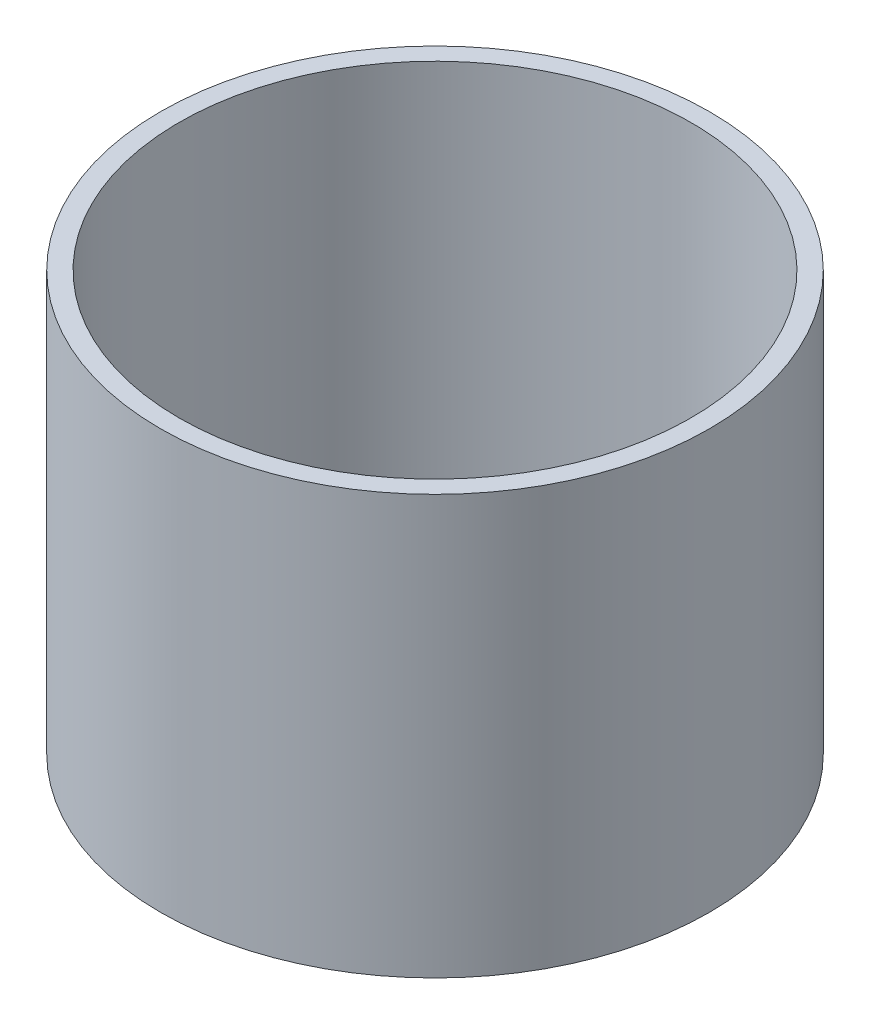
ISO-10303-21;
HEADER;
FILE_DESCRIPTION(('STEP AP214'),'2;1');
FILE_NAME('part.step','',(''),(''),'','','');
FILE_SCHEMA(('AUTOMOTIVE_DESIGN { 1 0 10303 214 1 1 1 1 }'));
ENDSEC;
DATA;
#1=APPLICATION_CONTEXT('core data for automotive mechanical design processes');
#2=APPLICATION_PROTOCOL_DEFINITION('international standard','automotive_design',2000,#1);
#3=PRODUCT_CONTEXT('',#1,'mechanical');
#4=PRODUCT('Part','Part','',(#3));
#5=PRODUCT_RELATED_PRODUCT_CATEGORY('part','',(#4));
#6=PRODUCT_DEFINITION_FORMATION('','',#4);
#7=PRODUCT_DEFINITION_CONTEXT('part definition',#1,'design');
#8=PRODUCT_DEFINITION('design','',#6,#7);
#9=PRODUCT_DEFINITION_SHAPE('','',#8);
#10=(LENGTH_UNIT() NAMED_UNIT(*) SI_UNIT(.MILLI.,.METRE.));
#11=(NAMED_UNIT(*) PLANE_ANGLE_UNIT() SI_UNIT($,.RADIAN.));
#12=(NAMED_UNIT(*) SI_UNIT($,.STERADIAN.) SOLID_ANGLE_UNIT());
#13=UNCERTAINTY_MEASURE_WITH_UNIT(LENGTH_MEASURE(1.E-05),#10,'distance_accuracy_value','');
#14=(GEOMETRIC_REPRESENTATION_CONTEXT(3) GLOBAL_UNCERTAINTY_ASSIGNED_CONTEXT((#13)) GLOBAL_UNIT_ASSIGNED_CONTEXT((#10,
#11,#12)) REPRESENTATION_CONTEXT('',''));
#15=CARTESIAN_POINT('',(0.,0.,0.));
#16=DIRECTION('',(0.,0.,1.));
#17=DIRECTION('',(1.,0.,0.));
#18=AXIS2_PLACEMENT_3D('',#15,#16,#17);
#19=CARTESIAN_POINT('',(0.,180.,0.));
#20=DIRECTION('',(0.,-1.,0.));
#21=DIRECTION('',(0.,0.,-1.));
#22=AXIS2_PLACEMENT_3D('',#19,#20,#21);
#23=CYLINDRICAL_SURFACE('',#22,118.);
#24=CARTESIAN_POINT('',(0.,180.,0.));
#25=DIRECTION('',(0.,1.,0.));
#26=DIRECTION('',(0.,0.,1.));
#27=AXIS2_PLACEMENT_3D('',#24,#25,#26);
#28=CIRCLE('',#27,118.);
#29=CARTESIAN_POINT('',(0.,180.,-118.));
#30=VERTEX_POINT('',#29);
#31=EDGE_CURVE('E196',#30,#30,#28,.T.);
#32=CARTESIAN_POINT('',(0.,0.,0.));
#33=DIRECTION('',(0.,1.,0.));
#34=DIRECTION('',(0.,0.,1.));
#35=AXIS2_PLACEMENT_3D('',#32,#33,#34);
#36=CIRCLE('',#35,118.);
#37=CARTESIAN_POINT('',(0.,0.,-118.));
#38=VERTEX_POINT('',#37);
#39=EDGE_CURVE('E195',#38,#38,#36,.T.);
#40=CARTESIAN_POINT('',(0.,180.,-118.));
#41=CARTESIAN_POINT('',(0.,178.125,-118.));
#42=CARTESIAN_POINT('',(0.,176.25,-118.));
#43=CARTESIAN_POINT('',(0.,172.5,-118.));
#44=CARTESIAN_POINT('',(0.,170.625,-118.));
#45=CARTESIAN_POINT('',(0.,166.875,-118.));
#46=CARTESIAN_POINT('',(0.,165.,-118.));
#47=CARTESIAN_POINT('',(0.,161.25,-118.));
#48=CARTESIAN_POINT('',(0.,159.375,-118.));
#49=CARTESIAN_POINT('',(0.,155.625,-118.));
#50=CARTESIAN_POINT('',(0.,153.75,-118.));
#51=CARTESIAN_POINT('',(0.,150.,-118.));
#52=CARTESIAN_POINT('',(0.,148.125,-118.));
#53=CARTESIAN_POINT('',(0.,144.375,-118.));
#54=CARTESIAN_POINT('',(0.,142.5,-118.));
#55=CARTESIAN_POINT('',(0.,138.75,-118.));
#56=CARTESIAN_POINT('',(0.,136.875,-118.));
#57=CARTESIAN_POINT('',(0.,133.125,-118.));
#58=CARTESIAN_POINT('',(0.,131.25,-118.));
#59=CARTESIAN_POINT('',(0.,127.5,-118.));
#60=CARTESIAN_POINT('',(0.,125.625,-118.));
#61=CARTESIAN_POINT('',(0.,121.875,-118.));
#62=CARTESIAN_POINT('',(0.,120.,-118.));
#63=CARTESIAN_POINT('',(0.,116.25,-118.));
#64=CARTESIAN_POINT('',(0.,114.375,-118.));
#65=CARTESIAN_POINT('',(0.,110.625,-118.));
#66=CARTESIAN_POINT('',(0.,108.75,-118.));
#67=CARTESIAN_POINT('',(0.,105.,-118.));
#68=CARTESIAN_POINT('',(0.,103.125,-118.));
#69=CARTESIAN_POINT('',(0.,99.375,-118.));
#70=CARTESIAN_POINT('',(0.,97.5,-118.));
#71=CARTESIAN_POINT('',(0.,93.75,-118.));
#72=CARTESIAN_POINT('',(0.,91.875,-118.));
#73=CARTESIAN_POINT('',(0.,88.125,-118.));
#74=CARTESIAN_POINT('',(0.,86.25,-118.));
#75=CARTESIAN_POINT('',(0.,82.5,-118.));
#76=CARTESIAN_POINT('',(0.,80.625,-118.));
#77=CARTESIAN_POINT('',(0.,76.875,-118.));
#78=CARTESIAN_POINT('',(0.,75.,-118.));
#79=CARTESIAN_POINT('',(0.,71.25,-118.));
#80=CARTESIAN_POINT('',(0.,69.375,-118.));
#81=CARTESIAN_POINT('',(0.,65.625,-118.));
#82=CARTESIAN_POINT('',(0.,63.75,-118.));
#83=CARTESIAN_POINT('',(0.,60.,-118.));
#84=CARTESIAN_POINT('',(0.,58.125,-118.));
#85=CARTESIAN_POINT('',(0.,54.375,-118.));
#86=CARTESIAN_POINT('',(0.,52.5,-118.));
#87=CARTESIAN_POINT('',(0.,48.75,-118.));
#88=CARTESIAN_POINT('',(0.,46.875,-118.));
#89=CARTESIAN_POINT('',(0.,43.125,-118.));
#90=CARTESIAN_POINT('',(0.,41.25,-118.));
#91=CARTESIAN_POINT('',(0.,37.5,-118.));
#92=CARTESIAN_POINT('',(0.,35.625,-118.));
#93=CARTESIAN_POINT('',(0.,31.875,-118.));
#94=CARTESIAN_POINT('',(0.,30.,-118.));
#95=CARTESIAN_POINT('',(0.,26.25,-118.));
#96=CARTESIAN_POINT('',(0.,24.375,-118.));
#97=CARTESIAN_POINT('',(0.,20.625,-118.));
#98=CARTESIAN_POINT('',(0.,18.75,-118.));
#99=CARTESIAN_POINT('',(0.,15.,-118.));
#100=CARTESIAN_POINT('',(0.,13.125,-118.));
#101=CARTESIAN_POINT('',(0.,9.37499999999998,-118.));
#102=CARTESIAN_POINT('',(0.,7.49999999999997,-118.));
#103=CARTESIAN_POINT('',(0.,3.74999999999997,-118.));
#104=CARTESIAN_POINT('',(0.,1.87499999999997,-118.));
#105=CARTESIAN_POINT('',(0.,0.,-118.));
#106=B_SPLINE_CURVE_WITH_KNOTS('',3,(#40,#41,#42,#43,#44,#45,#46,#47,#48,#49,#50,#51,#52,#53,
#54,#55,#56,#57,#58,#59,#60,#61,#62,#63,#64,#65,#66,#67,#68,#69,#70,#71,#72,#73,#74,#75,#76,#77,
#78,#79,#80,#81,#82,#83,#84,#85,#86,#87,#88,#89,#90,#91,#92,#93,#94,#95,#96,#97,#98,#99,#100,
#101,#102,#103,#104,#105),.UNSPECIFIED.,.F.,.F.,(4,2,2,2,2,2,2,2,2,2,2,2,2,2,2,2,2,2,2,2,2,2,2,
2,2,2,2,2,2,2,2,2,4),(0.,5.62500000000002,11.25,16.875,22.5,28.125,33.75,39.375,45.,50.625,
56.25,61.875,67.5,73.125,78.75,84.375,90.,95.625,101.25,106.875,112.5,118.125,123.75,129.375,
135.,140.625,146.25,151.875,157.5,163.125,168.75,174.375,180.),.UNSPECIFIED.);
#107=EDGE_CURVE('BSEAM44',#30,#38,#106,.T.);
#108=ORIENTED_EDGE('',*,*,#31,.F.);
#109=ORIENTED_EDGE('',*,*,#39,.T.);
#110=ORIENTED_EDGE('',*,*,#107,.T.);
#111=ORIENTED_EDGE('',*,*,#107,.F.);
#112=EDGE_LOOP('',(#108,#110,#109,#111));
#113=FACE_BOUND('',#112,.T.);
#114=ADVANCED_FACE('F44',(#113),#23,.T.);
#115=CARTESIAN_POINT('',(0.,180.,0.));
#116=DIRECTION('',(0.,1.,0.));
#117=DIRECTION('',(0.,0.,1.));
#118=AXIS2_PLACEMENT_3D('',#115,#116,#117);
#119=PLANE('',#118);
#120=CARTESIAN_POINT('',(0.,180.,0.));
#121=DIRECTION('',(0.,1.,0.));
#122=DIRECTION('',(0.,0.,1.));
#123=AXIS2_PLACEMENT_3D('',#120,#121,#122);
#124=CIRCLE('',#123,110.);
#125=CARTESIAN_POINT('',(0.,180.,110.));
#126=VERTEX_POINT('',#125);
#127=EDGE_CURVE('E178',#126,#126,#124,.T.);
#128=ORIENTED_EDGE('',*,*,#127,.F.);
#129=EDGE_LOOP('',(#128));
#130=FACE_BOUND('',#129,.T.);
#131=ORIENTED_EDGE('',*,*,#31,.T.);
#132=EDGE_LOOP('',(#131));
#133=FACE_BOUND('',#132,.T.);
#134=ADVANCED_FACE('F232',(#130,#133),#119,.T.);
#135=CARTESIAN_POINT('',(0.,0.,0.));
#136=DIRECTION('',(0.,1.,0.));
#137=DIRECTION('',(0.,0.,1.));
#138=AXIS2_PLACEMENT_3D('',#135,#136,#137);
#139=PLANE('',#138);
#140=DIRECTION('',(-1.,0.,0.));
#141=VECTOR('',#140,1.);
#142=CARTESIAN_POINT('',(-8.20167008536623,0.,57.0914097078924));
#143=LINE('',#142,#141);
#144=CARTESIAN_POINT('',(8.41597697617629,0.,57.0914097078924));
#145=VERTEX_POINT('',#144);
#146=CARTESIAN_POINT('',(-8.20167008536623,0.,57.0914097078924));
#147=VERTEX_POINT('',#146);
#148=EDGE_CURVE('E121',#145,#147,#143,.T.);
#149=ORIENTED_EDGE('',*,*,#148,.F.);
#150=DIRECTION('',(0.,0.,1.));
#151=VECTOR('',#150,1.);
#152=CARTESIAN_POINT('',(8.41597697617629,0.,57.0914097078924));
#153=LINE('',#152,#151);
#154=CARTESIAN_POINT('',(8.41597697617629,0.,32.0914097078925));
#155=VERTEX_POINT('',#154);
#156=EDGE_CURVE('E59',#155,#145,#153,.T.);
#157=ORIENTED_EDGE('',*,*,#156,.F.);
#158=DIRECTION('',(1.,0.,0.));
#159=VECTOR('',#158,1.);
#160=CARTESIAN_POINT('',(-8.20167008536623,0.,32.0914097078925));
#161=LINE('',#160,#159);
#162=CARTESIAN_POINT('',(-8.20167008536623,0.,32.0914097078925));
#163=VERTEX_POINT('',#162);
#164=EDGE_CURVE('E129',#163,#155,#161,.T.);
#165=ORIENTED_EDGE('',*,*,#164,.F.);
#166=DIRECTION('',(0.,0.,-1.));
#167=VECTOR('',#166,1.);
#168=CARTESIAN_POINT('',(-8.20167008536623,0.,57.0914097078924));
#169=LINE('',#168,#167);
#170=EDGE_CURVE('E111',#147,#163,#169,.T.);
#171=ORIENTED_EDGE('',*,*,#170,.F.);
#172=EDGE_LOOP('',(#149,#157,#165,#171));
#173=FACE_BOUND('',#172,.T.);
#174=DIRECTION('',(1.,0.,0.));
#175=VECTOR('',#174,1.);
#176=CARTESIAN_POINT('',(-9.885,0.,22.915));
#177=LINE('',#176,#175);
#178=CARTESIAN_POINT('',(-9.885,0.,22.915));
#179=VERTEX_POINT('',#178);
#180=CARTESIAN_POINT('',(9.885,0.,22.915));
#181=VERTEX_POINT('',#180);
#182=EDGE_CURVE('E157',#179,#181,#177,.T.);
#183=ORIENTED_EDGE('',*,*,#182,.T.);
#184=DIRECTION('',(0.,0.,-1.));
#185=VECTOR('',#184,1.);
#186=CARTESIAN_POINT('',(9.885,0.,-22.915));
#187=LINE('',#186,#185);
#188=CARTESIAN_POINT('',(9.885,0.,-22.915));
#189=VERTEX_POINT('',#188);
#190=EDGE_CURVE('E144',#181,#189,#187,.T.);
#191=ORIENTED_EDGE('',*,*,#190,.T.);
#192=DIRECTION('',(-1.,0.,0.));
#193=VECTOR('',#192,1.);
#194=CARTESIAN_POINT('',(-9.885,0.,-22.915));
#195=LINE('',#194,#193);
#196=CARTESIAN_POINT('',(-9.885,0.,-22.915));
#197=VERTEX_POINT('',#196);
#198=EDGE_CURVE('E148',#189,#197,#195,.T.);
#199=ORIENTED_EDGE('',*,*,#198,.T.);
#200=DIRECTION('',(0.,0.,1.));
#201=VECTOR('',#200,1.);
#202=CARTESIAN_POINT('',(-9.885,0.,-22.915));
#203=LINE('',#202,#201);
#204=EDGE_CURVE('E153',#197,#179,#203,.T.);
#205=ORIENTED_EDGE('',*,*,#204,.T.);
#206=EDGE_LOOP('',(#183,#191,#199,#205));
#207=FACE_BOUND('',#206,.T.);
#208=ORIENTED_EDGE('',*,*,#39,.F.);
#209=EDGE_LOOP('',(#208));
#210=FACE_BOUND('',#209,.T.);
#211=ADVANCED_FACE('F126',(#173,#207,#210),#139,.F.);
#212=CARTESIAN_POINT('',(0.,-311.126983722081,0.));
#213=DIRECTION('',(0.,1.,0.));
#214=DIRECTION('',(0.,0.,1.));
#215=AXIS2_PLACEMENT_3D('',#212,#213,#214);
#216=CYLINDRICAL_SURFACE('',#215,110.);
#217=CARTESIAN_POINT('',(0.,8.00000000000001,0.));
#218=DIRECTION('',(0.,1.,0.));
#219=DIRECTION('',(0.,0.,1.));
#220=AXIS2_PLACEMENT_3D('',#217,#218,#219);
#221=CIRCLE('',#220,110.);
#222=CARTESIAN_POINT('',(0.,7.99999999999995,110.));
#223=VERTEX_POINT('',#222);
#224=EDGE_CURVE('E191',#223,#223,#221,.F.);
#225=CARTESIAN_POINT('',(0.,7.99999999999995,110.));
#226=CARTESIAN_POINT('',(0.,9.79166666666662,110.));
#227=CARTESIAN_POINT('',(0.,11.5833333333333,110.));
#228=CARTESIAN_POINT('',(0.,15.1666666666666,110.));
#229=CARTESIAN_POINT('',(0.,16.9583333333333,110.));
#230=CARTESIAN_POINT('',(0.,20.5416666666666,110.));
#231=CARTESIAN_POINT('',(0.,22.3333333333333,110.));
#232=CARTESIAN_POINT('',(0.,25.9166666666666,110.));
#233=CARTESIAN_POINT('',(0.,27.7083333333333,110.));
#234=CARTESIAN_POINT('',(0.,31.2916666666666,110.));
#235=CARTESIAN_POINT('',(0.,33.0833333333333,110.));
#236=CARTESIAN_POINT('',(0.,36.6666666666666,110.));
#237=CARTESIAN_POINT('',(0.,38.4583333333333,110.));
#238=CARTESIAN_POINT('',(0.,42.0416666666666,110.));
#239=CARTESIAN_POINT('',(0.,43.8333333333333,110.));
#240=CARTESIAN_POINT('',(0.,47.4166666666666,110.));
#241=CARTESIAN_POINT('',(0.,49.2083333333333,110.));
#242=CARTESIAN_POINT('',(0.,52.7916666666666,110.));
#243=CARTESIAN_POINT('',(0.,54.5833333333333,110.));
#244=CARTESIAN_POINT('',(0.,58.1666666666666,110.));
#245=CARTESIAN_POINT('',(0.,59.9583333333333,110.));
#246=CARTESIAN_POINT('',(0.,63.5416666666666,110.));
#247=CARTESIAN_POINT('',(0.,65.3333333333333,110.));
#248=CARTESIAN_POINT('',(0.,68.9166666666666,110.));
#249=CARTESIAN_POINT('',(0.,70.7083333333333,110.));
#250=CARTESIAN_POINT('',(0.,74.2916666666666,110.));
#251=CARTESIAN_POINT('',(0.,76.0833333333333,110.));
#252=CARTESIAN_POINT('',(0.,79.6666666666666,110.));
#253=CARTESIAN_POINT('',(0.,81.4583333333333,110.));
#254=CARTESIAN_POINT('',(0.,85.0416666666666,110.));
#255=CARTESIAN_POINT('',(0.,86.8333333333333,110.));
#256=CARTESIAN_POINT('',(0.,90.4166666666666,110.));
#257=CARTESIAN_POINT('',(0.,92.2083333333333,110.));
#258=CARTESIAN_POINT('',(0.,95.7916666666666,110.));
#259=CARTESIAN_POINT('',(0.,97.5833333333333,110.));
#260=CARTESIAN_POINT('',(0.,101.166666666667,110.));
#261=CARTESIAN_POINT('',(0.,102.958333333333,110.));
#262=CARTESIAN_POINT('',(0.,106.541666666667,110.));
#263=CARTESIAN_POINT('',(0.,108.333333333333,110.));
#264=CARTESIAN_POINT('',(0.,111.916666666667,110.));
#265=CARTESIAN_POINT('',(0.,113.708333333333,110.));
#266=CARTESIAN_POINT('',(0.,117.291666666667,110.));
#267=CARTESIAN_POINT('',(0.,119.083333333333,110.));
#268=CARTESIAN_POINT('',(0.,122.666666666667,110.));
#269=CARTESIAN_POINT('',(0.,124.458333333333,110.));
#270=CARTESIAN_POINT('',(0.,128.041666666667,110.));
#271=CARTESIAN_POINT('',(0.,129.833333333333,110.));
#272=CARTESIAN_POINT('',(0.,133.416666666667,110.));
#273=CARTESIAN_POINT('',(0.,135.208333333333,110.));
#274=CARTESIAN_POINT('',(0.,138.791666666667,110.));
#275=CARTESIAN_POINT('',(0.,140.583333333333,110.));
#276=CARTESIAN_POINT('',(0.,144.166666666667,110.));
#277=CARTESIAN_POINT('',(0.,145.958333333333,110.));
#278=CARTESIAN_POINT('',(0.,149.541666666667,110.));
#279=CARTESIAN_POINT('',(0.,151.333333333333,110.));
#280=CARTESIAN_POINT('',(0.,154.916666666667,110.));
#281=CARTESIAN_POINT('',(0.,156.708333333333,110.));
#282=CARTESIAN_POINT('',(0.,160.291666666667,110.));
#283=CARTESIAN_POINT('',(0.,162.083333333333,110.));
#284=CARTESIAN_POINT('',(0.,165.666666666667,110.));
#285=CARTESIAN_POINT('',(0.,167.458333333333,110.));
#286=CARTESIAN_POINT('',(0.,171.041666666667,110.));
#287=CARTESIAN_POINT('',(0.,172.833333333333,110.));
#288=CARTESIAN_POINT('',(0.,176.416666666667,110.));
#289=CARTESIAN_POINT('',(0.,178.208333333333,110.));
#290=CARTESIAN_POINT('',(0.,180.,110.));
#291=B_SPLINE_CURVE_WITH_KNOTS('',3,(#225,#226,#227,#228,#229,#230,#231,#232,#233,#234,#235,
#236,#237,#238,#239,#240,#241,#242,#243,#244,#245,#246,#247,#248,#249,#250,#251,#252,#253,#254,
#255,#256,#257,#258,#259,#260,#261,#262,#263,#264,#265,#266,#267,#268,#269,#270,#271,#272,#273,
#274,#275,#276,#277,#278,#279,#280,#281,#282,#283,#284,#285,#286,#287,#288,#289,#290),
.UNSPECIFIED.,.F.,.F.,(4,2,2,2,2,2,2,2,2,2,2,2,2,2,2,2,2,2,2,2,2,2,2,2,2,2,2,2,2,2,2,2,4),(0.,
5.37500000000002,10.75,16.125,21.5,26.875,32.25,37.625,43.,48.375,53.75,59.125,64.5,69.875,
75.25,80.625,86.,91.375,96.75,102.125,107.5,112.875,118.25,123.625,129.,134.375,139.75,145.125,
150.5,155.875,161.25,166.625,172.),.UNSPECIFIED.);
#292=EDGE_CURVE('BSEAM244',#223,#126,#291,.T.);
#293=ORIENTED_EDGE('',*,*,#224,.T.);
#294=ORIENTED_EDGE('',*,*,#127,.T.);
#295=ORIENTED_EDGE('',*,*,#292,.T.);
#296=ORIENTED_EDGE('',*,*,#292,.F.);
#297=EDGE_LOOP('',(#293,#295,#294,#296));
#298=FACE_BOUND('',#297,.T.);
#299=ADVANCED_FACE('F244',(#298),#216,.F.);
#300=CARTESIAN_POINT('',(0.,8.,0.));
#301=DIRECTION('',(0.,1.,0.));
#302=DIRECTION('',(0.,0.,1.));
#303=AXIS2_PLACEMENT_3D('',#300,#301,#302);
#304=PLANE('',#303);
#305=DIRECTION('',(0.,0.,-1.));
#306=VECTOR('',#305,1.);
#307=CARTESIAN_POINT('',(8.41597697617629,8.,0.));
#308=LINE('',#307,#306);
#309=CARTESIAN_POINT('',(8.41597697617629,8.00000000000001,57.0914097078924));
#310=VERTEX_POINT('',#309);
#311=CARTESIAN_POINT('',(8.41597697617629,8.00000000000001,32.0914097078925));
#312=VERTEX_POINT('',#311);
#313=EDGE_CURVE('E12',#310,#312,#308,.T.);
#314=ORIENTED_EDGE('',*,*,#313,.F.);
#315=DIRECTION('',(1.,0.,0.));
#316=VECTOR('',#315,1.);
#317=CARTESIAN_POINT('',(0.,8.,57.0914097078924));
#318=LINE('',#317,#316);
#319=CARTESIAN_POINT('',(-8.20167008536623,8.,57.0914097078924));
#320=VERTEX_POINT('',#319);
#321=EDGE_CURVE('E200',#320,#310,#318,.T.);
#322=ORIENTED_EDGE('',*,*,#321,.F.);
#323=DIRECTION('',(0.,0.,1.));
#324=VECTOR('',#323,1.);
#325=CARTESIAN_POINT('',(-8.20167008536623,8.,0.));
#326=LINE('',#325,#324);
#327=CARTESIAN_POINT('',(-8.20167008536623,8.00000000000001,32.0914097078925));
#328=VERTEX_POINT('',#327);
#329=EDGE_CURVE('E114',#328,#320,#326,.T.);
#330=ORIENTED_EDGE('',*,*,#329,.F.);
#331=DIRECTION('',(-1.,0.,0.));
#332=VECTOR('',#331,1.);
#333=CARTESIAN_POINT('',(0.,8.,32.0914097078925));
#334=LINE('',#333,#332);
#335=EDGE_CURVE('E52',#312,#328,#334,.T.);
#336=ORIENTED_EDGE('',*,*,#335,.F.);
#337=EDGE_LOOP('',(#314,#322,#330,#336));
#338=FACE_BOUND('',#337,.T.);
#339=DIRECTION('',(0.,0.,-1.));
#340=VECTOR('',#339,1.);
#341=CARTESIAN_POINT('',(9.885,8.,-22.915));
#342=LINE('',#341,#340);
#343=CARTESIAN_POINT('',(9.885,8.,22.915));
#344=VERTEX_POINT('',#343);
#345=CARTESIAN_POINT('',(9.885,8.,-22.915));
#346=VERTEX_POINT('',#345);
#347=EDGE_CURVE('E139',#344,#346,#342,.T.);
#348=ORIENTED_EDGE('',*,*,#347,.F.);
#349=DIRECTION('',(1.,0.,0.));
#350=VECTOR('',#349,1.);
#351=CARTESIAN_POINT('',(-9.885,8.,22.915));
#352=LINE('',#351,#350);
#353=CARTESIAN_POINT('',(-9.885,8.,22.915));
#354=VERTEX_POINT('',#353);
#355=EDGE_CURVE('E149',#354,#344,#352,.T.);
#356=ORIENTED_EDGE('',*,*,#355,.F.);
#357=DIRECTION('',(0.,0.,1.));
#358=VECTOR('',#357,1.);
#359=CARTESIAN_POINT('',(-9.885,8.,-22.915));
#360=LINE('',#359,#358);
#361=CARTESIAN_POINT('',(-9.885,8.,-22.915));
#362=VERTEX_POINT('',#361);
#363=EDGE_CURVE('E169',#362,#354,#360,.T.);
#364=ORIENTED_EDGE('',*,*,#363,.F.);
#365=DIRECTION('',(-1.,0.,0.));
#366=VECTOR('',#365,1.);
#367=CARTESIAN_POINT('',(-9.885,8.,-22.915));
#368=LINE('',#367,#366);
#369=EDGE_CURVE('E165',#346,#362,#368,.T.);
#370=ORIENTED_EDGE('',*,*,#369,.F.);
#371=EDGE_LOOP('',(#348,#356,#364,#370));
#372=FACE_BOUND('',#371,.T.);
#373=ORIENTED_EDGE('',*,*,#224,.F.);
#374=EDGE_LOOP('',(#373));
#375=FACE_BOUND('',#374,.T.);
#376=ADVANCED_FACE('F214',(#338,#372,#375),#304,.T.);
#377=CARTESIAN_POINT('',(9.885,0.,-22.915));
#378=DIRECTION('',(1.,0.,0.));
#379=DIRECTION('',(0.,0.,-1.));
#380=AXIS2_PLACEMENT_3D('',#377,#378,#379);
#381=PLANE('',#380);
#382=ORIENTED_EDGE('',*,*,#347,.T.);
#383=DIRECTION('',(0.,1.,0.));
#384=VECTOR('',#383,1.);
#385=CARTESIAN_POINT('',(9.885,0.,-22.915));
#386=LINE('',#385,#384);
#387=EDGE_CURVE('E161',#189,#346,#386,.T.);
#388=ORIENTED_EDGE('',*,*,#387,.F.);
#389=ORIENTED_EDGE('',*,*,#190,.F.);
#390=DIRECTION('',(0.,1.,0.));
#391=VECTOR('',#390,1.);
#392=CARTESIAN_POINT('',(9.885,0.,22.915));
#393=LINE('',#392,#391);
#394=EDGE_CURVE('E175',#181,#344,#393,.T.);
#395=ORIENTED_EDGE('',*,*,#394,.T.);
#396=EDGE_LOOP('',(#382,#388,#389,#395));
#397=FACE_BOUND('',#396,.T.);
#398=ADVANCED_FACE('F253',(#397),#381,.F.);
#399=CARTESIAN_POINT('',(-9.885,0.,22.915));
#400=DIRECTION('',(0.,0.,1.));
#401=DIRECTION('',(1.,0.,0.));
#402=AXIS2_PLACEMENT_3D('',#399,#400,#401);
#403=PLANE('',#402);
#404=ORIENTED_EDGE('',*,*,#355,.T.);
#405=ORIENTED_EDGE('',*,*,#394,.F.);
#406=ORIENTED_EDGE('',*,*,#182,.F.);
#407=DIRECTION('',(0.,1.,0.));
#408=VECTOR('',#407,1.);
#409=CARTESIAN_POINT('',(-9.885,0.,22.915));
#410=LINE('',#409,#408);
#411=EDGE_CURVE('E179',#179,#354,#410,.T.);
#412=ORIENTED_EDGE('',*,*,#411,.T.);
#413=EDGE_LOOP('',(#404,#405,#406,#412));
#414=FACE_BOUND('',#413,.T.);
#415=ADVANCED_FACE('F255',(#414),#403,.F.);
#416=CARTESIAN_POINT('',(-9.885,0.,-22.915));
#417=DIRECTION('',(-1.,0.,0.));
#418=DIRECTION('',(0.,0.,1.));
#419=AXIS2_PLACEMENT_3D('',#416,#417,#418);
#420=PLANE('',#419);
#421=ORIENTED_EDGE('',*,*,#363,.T.);
#422=ORIENTED_EDGE('',*,*,#411,.F.);
#423=ORIENTED_EDGE('',*,*,#204,.F.);
#424=DIRECTION('',(0.,1.,0.));
#425=VECTOR('',#424,1.);
#426=CARTESIAN_POINT('',(-9.885,0.,-22.915));
#427=LINE('',#426,#425);
#428=EDGE_CURVE('E183',#197,#362,#427,.T.);
#429=ORIENTED_EDGE('',*,*,#428,.T.);
#430=EDGE_LOOP('',(#421,#422,#423,#429));
#431=FACE_BOUND('',#430,.T.);
#432=ADVANCED_FACE('F226',(#431),#420,.F.);
#433=CARTESIAN_POINT('',(-9.885,0.,-22.915));
#434=DIRECTION('',(0.,0.,-1.));
#435=DIRECTION('',(-1.,0.,0.));
#436=AXIS2_PLACEMENT_3D('',#433,#434,#435);
#437=PLANE('',#436);
#438=ORIENTED_EDGE('',*,*,#369,.T.);
#439=ORIENTED_EDGE('',*,*,#428,.F.);
#440=ORIENTED_EDGE('',*,*,#198,.F.);
#441=ORIENTED_EDGE('',*,*,#387,.T.);
#442=EDGE_LOOP('',(#438,#439,#440,#441));
#443=FACE_BOUND('',#442,.T.);
#444=ADVANCED_FACE('F219',(#443),#437,.F.);
#445=CARTESIAN_POINT('',(8.41597697617629,158.,57.0914097078924));
#446=DIRECTION('',(1.,0.,0.));
#447=DIRECTION('',(0.,0.,-1.));
#448=AXIS2_PLACEMENT_3D('',#445,#446,#447);
#449=PLANE('',#448);
#450=ORIENTED_EDGE('',*,*,#313,.T.);
#451=DIRECTION('',(0.,-1.,0.));
#452=VECTOR('',#451,1.);
#453=CARTESIAN_POINT('',(8.41597697617629,158.,32.0914097078925));
#454=LINE('',#453,#452);
#455=EDGE_CURVE('E136',#312,#155,#454,.T.);
#456=ORIENTED_EDGE('',*,*,#455,.T.);
#457=ORIENTED_EDGE('',*,*,#156,.T.);
#458=DIRECTION('',(0.,-1.,0.));
#459=VECTOR('',#458,1.);
#460=CARTESIAN_POINT('',(8.41597697617629,158.,57.0914097078924));
#461=LINE('',#460,#459);
#462=EDGE_CURVE('E118',#310,#145,#461,.T.);
#463=ORIENTED_EDGE('',*,*,#462,.F.);
#464=EDGE_LOOP('',(#450,#456,#457,#463));
#465=FACE_BOUND('',#464,.T.);
#466=ADVANCED_FACE('F216',(#465),#449,.F.);
#467=CARTESIAN_POINT('',(-8.20167008536623,158.,32.0914097078925));
#468=DIRECTION('',(0.,0.,-1.));
#469=DIRECTION('',(-1.,0.,0.));
#470=AXIS2_PLACEMENT_3D('',#467,#468,#469);
#471=PLANE('',#470);
#472=ORIENTED_EDGE('',*,*,#335,.T.);
#473=DIRECTION('',(0.,-1.,0.));
#474=VECTOR('',#473,1.);
#475=CARTESIAN_POINT('',(-8.20167008536623,158.,32.0914097078925));
#476=LINE('',#475,#474);
#477=EDGE_CURVE('E117',#328,#163,#476,.T.);
#478=ORIENTED_EDGE('',*,*,#477,.T.);
#479=ORIENTED_EDGE('',*,*,#164,.T.);
#480=ORIENTED_EDGE('',*,*,#455,.F.);
#481=EDGE_LOOP('',(#472,#478,#479,#480));
#482=FACE_BOUND('',#481,.T.);
#483=ADVANCED_FACE('F211',(#482),#471,.F.);
#484=CARTESIAN_POINT('',(-8.20167008536623,158.,57.0914097078924));
#485=DIRECTION('',(-1.,0.,0.));
#486=DIRECTION('',(0.,0.,1.));
#487=AXIS2_PLACEMENT_3D('',#484,#485,#486);
#488=PLANE('',#487);
#489=ORIENTED_EDGE('',*,*,#329,.T.);
#490=DIRECTION('',(0.,-1.,0.));
#491=VECTOR('',#490,1.);
#492=CARTESIAN_POINT('',(-8.20167008536623,158.,57.0914097078924));
#493=LINE('',#492,#491);
#494=EDGE_CURVE('E67',#320,#147,#493,.T.);
#495=ORIENTED_EDGE('',*,*,#494,.T.);
#496=ORIENTED_EDGE('',*,*,#170,.T.);
#497=ORIENTED_EDGE('',*,*,#477,.F.);
#498=EDGE_LOOP('',(#489,#495,#496,#497));
#499=FACE_BOUND('',#498,.T.);
#500=ADVANCED_FACE('F108',(#499),#488,.F.);
#501=CARTESIAN_POINT('',(-8.20167008536623,158.,57.0914097078924));
#502=DIRECTION('',(0.,0.,1.));
#503=DIRECTION('',(1.,0.,0.));
#504=AXIS2_PLACEMENT_3D('',#501,#502,#503);
#505=PLANE('',#504);
#506=ORIENTED_EDGE('',*,*,#321,.T.);
#507=ORIENTED_EDGE('',*,*,#462,.T.);
#508=ORIENTED_EDGE('',*,*,#148,.T.);
#509=ORIENTED_EDGE('',*,*,#494,.F.);
#510=EDGE_LOOP('',(#506,#507,#508,#509));
#511=FACE_BOUND('',#510,.T.);
#512=ADVANCED_FACE('F122',(#511),#505,.F.);
#513=CLOSED_SHELL('',(#114,#134,#211,#299,#376,#398,#415,#432,#444,#466,#483,#500,#512));
#514=MANIFOLD_SOLID_BREP('B2',#513);
#515=ADVANCED_BREP_SHAPE_REPRESENTATION('',(#18,#514),#14);
#516=SHAPE_DEFINITION_REPRESENTATION(#9,#515);
ENDSEC;
END-ISO-10303-21;
